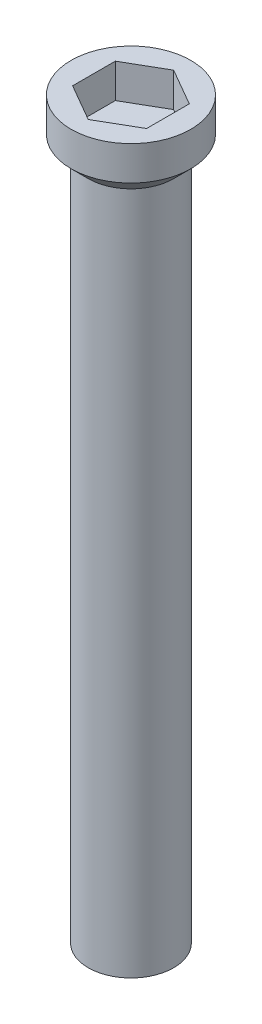
ISO-10303-21;
HEADER;
FILE_DESCRIPTION(('STEP AP214'),'2;1');
FILE_NAME('part.step','',(''),(''),'','','');
FILE_SCHEMA(('AUTOMOTIVE_DESIGN { 1 0 10303 214 1 1 1 1 }'));
ENDSEC;
DATA;
#1=APPLICATION_CONTEXT('core data for automotive mechanical design processes');
#2=APPLICATION_PROTOCOL_DEFINITION('international standard','automotive_design',2000,#1);
#3=PRODUCT_CONTEXT('',#1,'mechanical');
#4=PRODUCT('Part','Part','',(#3));
#5=PRODUCT_RELATED_PRODUCT_CATEGORY('part','',(#4));
#6=PRODUCT_DEFINITION_FORMATION('','',#4);
#7=PRODUCT_DEFINITION_CONTEXT('part definition',#1,'design');
#8=PRODUCT_DEFINITION('design','',#6,#7);
#9=PRODUCT_DEFINITION_SHAPE('','',#8);
#10=(LENGTH_UNIT() NAMED_UNIT(*) SI_UNIT(.MILLI.,.METRE.));
#11=(NAMED_UNIT(*) PLANE_ANGLE_UNIT() SI_UNIT($,.RADIAN.));
#12=(NAMED_UNIT(*) SI_UNIT($,.STERADIAN.) SOLID_ANGLE_UNIT());
#13=UNCERTAINTY_MEASURE_WITH_UNIT(LENGTH_MEASURE(1.E-05),#10,'distance_accuracy_value','');
#14=(GEOMETRIC_REPRESENTATION_CONTEXT(3) GLOBAL_UNCERTAINTY_ASSIGNED_CONTEXT((#13)) GLOBAL_UNIT_ASSIGNED_CONTEXT((#10,
#11,#12)) REPRESENTATION_CONTEXT('',''));
#15=CARTESIAN_POINT('',(0.,0.,0.));
#16=DIRECTION('',(0.,0.,1.));
#17=DIRECTION('',(1.,0.,0.));
#18=AXIS2_PLACEMENT_3D('',#15,#16,#17);
#19=CARTESIAN_POINT('',(0.,40.,0.));
#20=DIRECTION('',(0.,-1.,0.));
#21=DIRECTION('',(0.,0.,-1.));
#22=AXIS2_PLACEMENT_3D('',#19,#20,#21);
#23=CYLINDRICAL_SURFACE('',#22,2.5);
#24=CARTESIAN_POINT('',(0.,40.,0.));
#25=DIRECTION('',(0.,1.,0.));
#26=DIRECTION('',(0.,0.,1.));
#27=AXIS2_PLACEMENT_3D('',#24,#25,#26);
#28=CIRCLE('',#27,2.5);
#29=CARTESIAN_POINT('',(0.,40.,2.5));
#30=VERTEX_POINT('',#29);
#31=EDGE_CURVE('E52',#30,#30,#28,.T.);
#32=ORIENTED_EDGE('',*,*,#31,.F.);
#33=EDGE_LOOP('',(#32));
#34=FACE_BOUND('',#33,.T.);
#35=CARTESIAN_POINT('',(0.,0.,0.));
#36=DIRECTION('',(0.,1.,0.));
#37=DIRECTION('',(0.,0.,1.));
#38=AXIS2_PLACEMENT_3D('',#35,#36,#37);
#39=CIRCLE('',#38,2.5);
#40=CARTESIAN_POINT('',(0.,0.,2.5));
#41=VERTEX_POINT('',#40);
#42=EDGE_CURVE('E154',#41,#41,#39,.T.);
#43=ORIENTED_EDGE('',*,*,#42,.T.);
#44=EDGE_LOOP('',(#43));
#45=FACE_BOUND('',#44,.T.);
#46=ADVANCED_FACE('F43',(#34,#45),#23,.T.);
#47=CARTESIAN_POINT('',(0.,0.,0.));
#48=DIRECTION('',(0.,1.,0.));
#49=DIRECTION('',(0.,0.,1.));
#50=AXIS2_PLACEMENT_3D('',#47,#48,#49);
#51=PLANE('',#50);
#52=ORIENTED_EDGE('',*,*,#42,.F.);
#53=EDGE_LOOP('',(#52));
#54=FACE_BOUND('',#53,.T.);
#55=ADVANCED_FACE('F160',(#54),#51,.F.);
#56=CARTESIAN_POINT('',(0.,43.,0.));
#57=DIRECTION('',(0.,-1.,0.));
#58=DIRECTION('',(0.,0.,-1.));
#59=AXIS2_PLACEMENT_3D('',#56,#57,#58);
#60=CYLINDRICAL_SURFACE('',#59,3.5);
#61=CARTESIAN_POINT('',(0.,41.,0.));
#62=DIRECTION('',(0.,1.,0.));
#63=DIRECTION('',(0.,0.,1.));
#64=AXIS2_PLACEMENT_3D('',#61,#62,#63);
#65=CIRCLE('',#64,3.5);
#66=CARTESIAN_POINT('',(0.,41.,3.5));
#67=VERTEX_POINT('',#66);
#68=EDGE_CURVE('E11',#67,#67,#65,.T.);
#69=ORIENTED_EDGE('',*,*,#68,.T.);
#70=EDGE_LOOP('',(#69));
#71=FACE_BOUND('',#70,.T.);
#72=CARTESIAN_POINT('',(0.,43.,0.));
#73=DIRECTION('',(0.,1.,0.));
#74=DIRECTION('',(0.,0.,1.));
#75=AXIS2_PLACEMENT_3D('',#72,#73,#74);
#76=CIRCLE('',#75,3.5);
#77=CARTESIAN_POINT('',(0.,43.,3.5));
#78=VERTEX_POINT('',#77);
#79=EDGE_CURVE('E146',#78,#78,#76,.T.);
#80=ORIENTED_EDGE('',*,*,#79,.F.);
#81=EDGE_LOOP('',(#80));
#82=FACE_BOUND('',#81,.T.);
#83=ADVANCED_FACE('F162',(#71,#82),#60,.T.);
#84=CARTESIAN_POINT('',(0.,43.,0.));
#85=DIRECTION('',(0.,1.,0.));
#86=DIRECTION('',(0.,0.,1.));
#87=AXIS2_PLACEMENT_3D('',#84,#85,#86);
#88=PLANE('',#87);
#89=DIRECTION('',(-0.866025403784439,0.,-0.5));
#90=VECTOR('',#89,1.);
#91=CARTESIAN_POINT('',(2.1650635094611,43.,-1.25));
#92=LINE('',#91,#90);
#93=CARTESIAN_POINT('',(2.1650635094611,43.,-1.25));
#94=VERTEX_POINT('',#93);
#95=CARTESIAN_POINT('',(0.,43.,-2.5));
#96=VERTEX_POINT('',#95);
#97=EDGE_CURVE('E59',#94,#96,#92,.T.);
#98=ORIENTED_EDGE('',*,*,#97,.F.);
#99=DIRECTION('',(0.,0.,-1.));
#100=VECTOR('',#99,1.);
#101=CARTESIAN_POINT('',(2.1650635094611,43.,1.25));
#102=LINE('',#101,#100);
#103=CARTESIAN_POINT('',(2.1650635094611,43.,1.25));
#104=VERTEX_POINT('',#103);
#105=EDGE_CURVE('E142',#104,#94,#102,.T.);
#106=ORIENTED_EDGE('',*,*,#105,.F.);
#107=DIRECTION('',(0.866025403784439,0.,-0.5));
#108=VECTOR('',#107,1.);
#109=CARTESIAN_POINT('',(0.,43.,2.5));
#110=LINE('',#109,#108);
#111=CARTESIAN_POINT('',(0.,43.,2.5));
#112=VERTEX_POINT('',#111);
#113=EDGE_CURVE('E140',#112,#104,#110,.T.);
#114=ORIENTED_EDGE('',*,*,#113,.F.);
#115=DIRECTION('',(0.866025403784439,0.,0.5));
#116=VECTOR('',#115,1.);
#117=CARTESIAN_POINT('',(-2.1650635094611,43.,1.25));
#118=LINE('',#117,#116);
#119=CARTESIAN_POINT('',(-2.1650635094611,43.,1.25));
#120=VERTEX_POINT('',#119);
#121=EDGE_CURVE('E107',#120,#112,#118,.T.);
#122=ORIENTED_EDGE('',*,*,#121,.F.);
#123=DIRECTION('',(0.,0.,1.));
#124=VECTOR('',#123,1.);
#125=CARTESIAN_POINT('',(-2.1650635094611,43.,-1.25));
#126=LINE('',#125,#124);
#127=CARTESIAN_POINT('',(-2.1650635094611,43.,-1.25));
#128=VERTEX_POINT('',#127);
#129=EDGE_CURVE('E136',#128,#120,#126,.T.);
#130=ORIENTED_EDGE('',*,*,#129,.F.);
#131=DIRECTION('',(-0.866025403784439,0.,0.5));
#132=VECTOR('',#131,1.);
#133=CARTESIAN_POINT('',(0.,43.,-2.5));
#134=LINE('',#133,#132);
#135=EDGE_CURVE('E133',#96,#128,#134,.T.);
#136=ORIENTED_EDGE('',*,*,#135,.F.);
#137=EDGE_LOOP('',(#98,#106,#114,#122,#130,#136));
#138=FACE_BOUND('',#137,.T.);
#139=ORIENTED_EDGE('',*,*,#79,.T.);
#140=EDGE_LOOP('',(#139));
#141=FACE_BOUND('',#140,.T.);
#142=ADVANCED_FACE('F169',(#138,#141),#88,.T.);
#143=CARTESIAN_POINT('',(2.1650635094611,41.,-1.25));
#144=DIRECTION('',(0.5,0.,-0.866025403784439));
#145=DIRECTION('',(-0.866025403784439,0.,-0.5));
#146=AXIS2_PLACEMENT_3D('',#143,#144,#145);
#147=PLANE('',#146);
#148=ORIENTED_EDGE('',*,*,#97,.T.);
#149=DIRECTION('',(0.,1.,0.));
#150=VECTOR('',#149,1.);
#151=CARTESIAN_POINT('',(0.,41.,-2.5));
#152=LINE('',#151,#150);
#153=CARTESIAN_POINT('',(0.,41.,-2.5));
#154=VERTEX_POINT('',#153);
#155=EDGE_CURVE('E89',#154,#96,#152,.T.);
#156=ORIENTED_EDGE('',*,*,#155,.F.);
#157=DIRECTION('',(-0.866025403784439,0.,-0.5));
#158=VECTOR('',#157,1.);
#159=CARTESIAN_POINT('',(2.1650635094611,41.,-1.25));
#160=LINE('',#159,#158);
#161=CARTESIAN_POINT('',(2.1650635094611,41.,-1.25));
#162=VERTEX_POINT('',#161);
#163=EDGE_CURVE('E144',#162,#154,#160,.T.);
#164=ORIENTED_EDGE('',*,*,#163,.F.);
#165=DIRECTION('',(0.,1.,0.));
#166=VECTOR('',#165,1.);
#167=CARTESIAN_POINT('',(2.1650635094611,41.,-1.25));
#168=LINE('',#167,#166);
#169=EDGE_CURVE('E67',#162,#94,#168,.T.);
#170=ORIENTED_EDGE('',*,*,#169,.T.);
#171=EDGE_LOOP('',(#148,#156,#164,#170));
#172=FACE_BOUND('',#171,.T.);
#173=ADVANCED_FACE('F175',(#172),#147,.F.);
#174=CARTESIAN_POINT('',(2.1650635094611,41.,1.25));
#175=DIRECTION('',(1.,0.,0.));
#176=DIRECTION('',(0.,0.,-1.));
#177=AXIS2_PLACEMENT_3D('',#174,#175,#176);
#178=PLANE('',#177);
#179=ORIENTED_EDGE('',*,*,#105,.T.);
#180=ORIENTED_EDGE('',*,*,#169,.F.);
#181=DIRECTION('',(0.,0.,-1.));
#182=VECTOR('',#181,1.);
#183=CARTESIAN_POINT('',(2.1650635094611,41.,1.25));
#184=LINE('',#183,#182);
#185=CARTESIAN_POINT('',(2.1650635094611,41.,1.25));
#186=VERTEX_POINT('',#185);
#187=EDGE_CURVE('E119',#186,#162,#184,.T.);
#188=ORIENTED_EDGE('',*,*,#187,.F.);
#189=DIRECTION('',(0.,1.,0.));
#190=VECTOR('',#189,1.);
#191=CARTESIAN_POINT('',(2.1650635094611,41.,1.25));
#192=LINE('',#191,#190);
#193=EDGE_CURVE('E111',#186,#104,#192,.T.);
#194=ORIENTED_EDGE('',*,*,#193,.T.);
#195=EDGE_LOOP('',(#179,#180,#188,#194));
#196=FACE_BOUND('',#195,.T.);
#197=ADVANCED_FACE('F179',(#196),#178,.F.);
#198=CARTESIAN_POINT('',(0.,41.,2.5));
#199=DIRECTION('',(0.5,0.,0.866025403784439));
#200=DIRECTION('',(0.866025403784439,0.,-0.5));
#201=AXIS2_PLACEMENT_3D('',#198,#199,#200);
#202=PLANE('',#201);
#203=ORIENTED_EDGE('',*,*,#113,.T.);
#204=ORIENTED_EDGE('',*,*,#193,.F.);
#205=DIRECTION('',(0.866025403784439,0.,-0.5));
#206=VECTOR('',#205,1.);
#207=CARTESIAN_POINT('',(0.,41.,2.5));
#208=LINE('',#207,#206);
#209=CARTESIAN_POINT('',(0.,41.,2.5));
#210=VERTEX_POINT('',#209);
#211=EDGE_CURVE('E115',#210,#186,#208,.T.);
#212=ORIENTED_EDGE('',*,*,#211,.F.);
#213=DIRECTION('',(0.,1.,0.));
#214=VECTOR('',#213,1.);
#215=CARTESIAN_POINT('',(0.,41.,2.5));
#216=LINE('',#215,#214);
#217=EDGE_CURVE('E100',#210,#112,#216,.T.);
#218=ORIENTED_EDGE('',*,*,#217,.T.);
#219=EDGE_LOOP('',(#203,#204,#212,#218));
#220=FACE_BOUND('',#219,.T.);
#221=ADVANCED_FACE('F116',(#220),#202,.F.);
#222=CARTESIAN_POINT('',(-2.1650635094611,41.,1.25));
#223=DIRECTION('',(-0.5,0.,0.866025403784439));
#224=DIRECTION('',(0.866025403784439,0.,0.5));
#225=AXIS2_PLACEMENT_3D('',#222,#223,#224);
#226=PLANE('',#225);
#227=ORIENTED_EDGE('',*,*,#121,.T.);
#228=ORIENTED_EDGE('',*,*,#217,.F.);
#229=DIRECTION('',(0.866025403784439,0.,0.5));
#230=VECTOR('',#229,1.);
#231=CARTESIAN_POINT('',(-2.1650635094611,41.,1.25));
#232=LINE('',#231,#230);
#233=CARTESIAN_POINT('',(-2.1650635094611,41.,1.25));
#234=VERTEX_POINT('',#233);
#235=EDGE_CURVE('E104',#234,#210,#232,.T.);
#236=ORIENTED_EDGE('',*,*,#235,.F.);
#237=DIRECTION('',(0.,1.,0.));
#238=VECTOR('',#237,1.);
#239=CARTESIAN_POINT('',(-2.1650635094611,41.,1.25));
#240=LINE('',#239,#238);
#241=EDGE_CURVE('E112',#234,#120,#240,.T.);
#242=ORIENTED_EDGE('',*,*,#241,.T.);
#243=EDGE_LOOP('',(#227,#228,#236,#242));
#244=FACE_BOUND('',#243,.T.);
#245=ADVANCED_FACE('F102',(#244),#226,.F.);
#246=CARTESIAN_POINT('',(-2.1650635094611,41.,-1.25));
#247=DIRECTION('',(-1.,0.,0.));
#248=DIRECTION('',(0.,0.,1.));
#249=AXIS2_PLACEMENT_3D('',#246,#247,#248);
#250=PLANE('',#249);
#251=ORIENTED_EDGE('',*,*,#129,.T.);
#252=ORIENTED_EDGE('',*,*,#241,.F.);
#253=DIRECTION('',(0.,0.,1.));
#254=VECTOR('',#253,1.);
#255=CARTESIAN_POINT('',(-2.1650635094611,41.,-1.25));
#256=LINE('',#255,#254);
#257=CARTESIAN_POINT('',(-2.1650635094611,41.,-1.25));
#258=VERTEX_POINT('',#257);
#259=EDGE_CURVE('E125',#258,#234,#256,.T.);
#260=ORIENTED_EDGE('',*,*,#259,.F.);
#261=DIRECTION('',(0.,1.,0.));
#262=VECTOR('',#261,1.);
#263=CARTESIAN_POINT('',(-2.1650635094611,41.,-1.25));
#264=LINE('',#263,#262);
#265=EDGE_CURVE('E149',#258,#128,#264,.T.);
#266=ORIENTED_EDGE('',*,*,#265,.T.);
#267=EDGE_LOOP('',(#251,#252,#260,#266));
#268=FACE_BOUND('',#267,.T.);
#269=ADVANCED_FACE('F183',(#268),#250,.F.);
#270=CARTESIAN_POINT('',(0.,41.,-2.5));
#271=DIRECTION('',(-0.5,0.,-0.866025403784439));
#272=DIRECTION('',(-0.866025403784439,0.,0.5));
#273=AXIS2_PLACEMENT_3D('',#270,#271,#272);
#274=PLANE('',#273);
#275=ORIENTED_EDGE('',*,*,#135,.T.);
#276=ORIENTED_EDGE('',*,*,#265,.F.);
#277=DIRECTION('',(-0.866025403784439,0.,0.5));
#278=VECTOR('',#277,1.);
#279=CARTESIAN_POINT('',(0.,41.,-2.5));
#280=LINE('',#279,#278);
#281=EDGE_CURVE('E127',#154,#258,#280,.T.);
#282=ORIENTED_EDGE('',*,*,#281,.F.);
#283=ORIENTED_EDGE('',*,*,#155,.T.);
#284=EDGE_LOOP('',(#275,#276,#282,#283));
#285=FACE_BOUND('',#284,.T.);
#286=ADVANCED_FACE('F180',(#285),#274,.F.);
#287=CARTESIAN_POINT('',(0.,41.,0.));
#288=DIRECTION('',(0.,1.,0.));
#289=DIRECTION('',(0.,0.,1.));
#290=AXIS2_PLACEMENT_3D('',#287,#288,#289);
#291=PLANE('',#290);
#292=ORIENTED_EDGE('',*,*,#163,.T.);
#293=ORIENTED_EDGE('',*,*,#281,.T.);
#294=ORIENTED_EDGE('',*,*,#259,.T.);
#295=ORIENTED_EDGE('',*,*,#235,.T.);
#296=ORIENTED_EDGE('',*,*,#211,.T.);
#297=ORIENTED_EDGE('',*,*,#187,.T.);
#298=EDGE_LOOP('',(#292,#293,#294,#295,#296,#297));
#299=FACE_BOUND('',#298,.T.);
#300=ADVANCED_FACE('F122',(#299),#291,.T.);
#301=CARTESIAN_POINT('',(0.,41.,0.));
#302=DIRECTION('',(0.,1.,0.));
#303=DIRECTION('',(0.,0.,1.));
#304=AXIS2_PLACEMENT_3D('',#301,#302,#303);
#305=CONICAL_SURFACE('',#304,3.5,0.78539816339745);
#306=ORIENTED_EDGE('',*,*,#31,.T.);
#307=EDGE_LOOP('',(#306));
#308=FACE_BOUND('',#307,.T.);
#309=ORIENTED_EDGE('',*,*,#68,.F.);
#310=EDGE_LOOP('',(#309));
#311=FACE_BOUND('',#310,.T.);
#312=ADVANCED_FACE('F46',(#308,#311),#305,.T.);
#313=CLOSED_SHELL('',(#46,#55,#83,#142,#173,#197,#221,#245,#269,#286,#300,#312));
#314=MANIFOLD_SOLID_BREP('B2',#313);
#315=ADVANCED_BREP_SHAPE_REPRESENTATION('',(#18,#314),#14);
#316=SHAPE_DEFINITION_REPRESENTATION(#9,#315);
ENDSEC;
END-ISO-10303-21;
